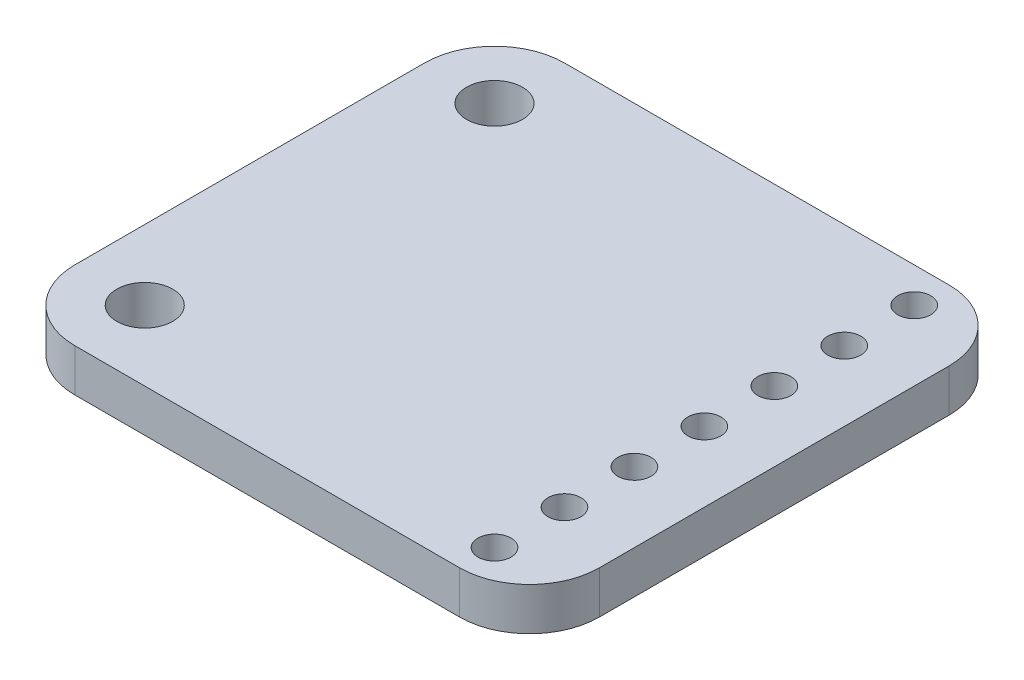
ISO-10303-21;
HEADER;
FILE_DESCRIPTION(('STEP AP214'),'2;1');
FILE_NAME('part.step','',(''),(''),'','','');
FILE_SCHEMA(('AUTOMOTIVE_DESIGN { 1 0 10303 214 1 1 1 1 }'));
ENDSEC;
DATA;
#1=APPLICATION_CONTEXT('core data for automotive mechanical design processes');
#2=APPLICATION_PROTOCOL_DEFINITION('international standard','automotive_design',2000,#1);
#3=PRODUCT_CONTEXT('',#1,'mechanical');
#4=PRODUCT('Part','Part','',(#3));
#5=PRODUCT_RELATED_PRODUCT_CATEGORY('part','',(#4));
#6=PRODUCT_DEFINITION_FORMATION('','',#4);
#7=PRODUCT_DEFINITION_CONTEXT('part definition',#1,'design');
#8=PRODUCT_DEFINITION('design','',#6,#7);
#9=PRODUCT_DEFINITION_SHAPE('','',#8);
#10=(LENGTH_UNIT() NAMED_UNIT(*) SI_UNIT(.MILLI.,.METRE.));
#11=(NAMED_UNIT(*) PLANE_ANGLE_UNIT() SI_UNIT($,.RADIAN.));
#12=(NAMED_UNIT(*) SI_UNIT($,.STERADIAN.) SOLID_ANGLE_UNIT());
#13=UNCERTAINTY_MEASURE_WITH_UNIT(LENGTH_MEASURE(1.E-05),#10,'distance_accuracy_value','');
#14=(GEOMETRIC_REPRESENTATION_CONTEXT(3) GLOBAL_UNCERTAINTY_ASSIGNED_CONTEXT((#13)) GLOBAL_UNIT_ASSIGNED_CONTEXT((#10,
#11,#12)) REPRESENTATION_CONTEXT('',''));
#15=CARTESIAN_POINT('',(0.,0.,0.));
#16=DIRECTION('',(0.,0.,1.));
#17=DIRECTION('',(1.,0.,0.));
#18=AXIS2_PLACEMENT_3D('',#15,#16,#17);
#19=CARTESIAN_POINT('',(0.,1.55,0.));
#20=DIRECTION('',(0.,1.,0.));
#21=DIRECTION('',(0.,0.,1.));
#22=AXIS2_PLACEMENT_3D('',#19,#20,#21);
#23=PLANE('',#22);
#24=CARTESIAN_POINT('',(-6.985,1.55,6.35));
#25=DIRECTION('',(0.,1.,0.));
#26=DIRECTION('',(0.,0.,1.));
#27=AXIS2_PLACEMENT_3D('',#24,#25,#26);
#28=CIRCLE('',#27,1.016);
#29=CARTESIAN_POINT('',(-6.985,1.55,7.366));
#30=VERTEX_POINT('',#29);
#31=EDGE_CURVE('E152',#30,#30,#28,.F.);
#32=ORIENTED_EDGE('',*,*,#31,.T.);
#33=EDGE_LOOP('',(#32));
#34=FACE_BOUND('',#33,.T.);
#35=CARTESIAN_POINT('',(-6.985,1.55,-6.35));
#36=DIRECTION('',(0.,1.,0.));
#37=DIRECTION('',(0.,0.,1.));
#38=AXIS2_PLACEMENT_3D('',#35,#36,#37);
#39=CIRCLE('',#38,1.016);
#40=CARTESIAN_POINT('',(-6.985,1.55,-5.334));
#41=VERTEX_POINT('',#40);
#42=EDGE_CURVE('E155',#41,#41,#39,.F.);
#43=ORIENTED_EDGE('',*,*,#42,.T.);
#44=EDGE_LOOP('',(#43));
#45=FACE_BOUND('',#44,.T.);
#46=CARTESIAN_POINT('',(6.985,1.55,7.62));
#47=DIRECTION('',(0.,1.,0.));
#48=DIRECTION('',(0.,0.,1.));
#49=AXIS2_PLACEMENT_3D('',#46,#47,#48);
#50=CIRCLE('',#49,0.6);
#51=CARTESIAN_POINT('',(6.985,1.55,8.22));
#52=VERTEX_POINT('',#51);
#53=EDGE_CURVE('E158',#52,#52,#50,.F.);
#54=ORIENTED_EDGE('',*,*,#53,.T.);
#55=EDGE_LOOP('',(#54));
#56=FACE_BOUND('',#55,.T.);
#57=CARTESIAN_POINT('',(6.985,1.55,2.54));
#58=DIRECTION('',(0.,1.,0.));
#59=DIRECTION('',(0.,0.,1.));
#60=AXIS2_PLACEMENT_3D('',#57,#58,#59);
#61=CIRCLE('',#60,0.6);
#62=CARTESIAN_POINT('',(6.985,1.55,3.14));
#63=VERTEX_POINT('',#62);
#64=EDGE_CURVE('E161',#63,#63,#61,.F.);
#65=ORIENTED_EDGE('',*,*,#64,.T.);
#66=EDGE_LOOP('',(#65));
#67=FACE_BOUND('',#66,.T.);
#68=CARTESIAN_POINT('',(6.985,1.55,-2.54));
#69=DIRECTION('',(0.,1.,0.));
#70=DIRECTION('',(0.,0.,1.));
#71=AXIS2_PLACEMENT_3D('',#68,#69,#70);
#72=CIRCLE('',#71,0.6);
#73=CARTESIAN_POINT('',(6.985,1.55,-1.94));
#74=VERTEX_POINT('',#73);
#75=EDGE_CURVE('E164',#74,#74,#72,.F.);
#76=ORIENTED_EDGE('',*,*,#75,.T.);
#77=EDGE_LOOP('',(#76));
#78=FACE_BOUND('',#77,.T.);
#79=CARTESIAN_POINT('',(6.985,1.55,-7.62));
#80=DIRECTION('',(0.,1.,0.));
#81=DIRECTION('',(0.,0.,1.));
#82=AXIS2_PLACEMENT_3D('',#79,#80,#81);
#83=CIRCLE('',#82,0.6);
#84=CARTESIAN_POINT('',(6.985,1.55,-7.02));
#85=VERTEX_POINT('',#84);
#86=EDGE_CURVE('E167',#85,#85,#83,.F.);
#87=ORIENTED_EDGE('',*,*,#86,.T.);
#88=EDGE_LOOP('',(#87));
#89=FACE_BOUND('',#88,.T.);
#90=CARTESIAN_POINT('',(6.985,1.55,-5.08));
#91=DIRECTION('',(0.,1.,0.));
#92=DIRECTION('',(0.,0.,1.));
#93=AXIS2_PLACEMENT_3D('',#90,#91,#92);
#94=CIRCLE('',#93,0.6);
#95=CARTESIAN_POINT('',(6.985,1.55,-4.48));
#96=VERTEX_POINT('',#95);
#97=EDGE_CURVE('E170',#96,#96,#94,.F.);
#98=ORIENTED_EDGE('',*,*,#97,.T.);
#99=EDGE_LOOP('',(#98));
#100=FACE_BOUND('',#99,.T.);
#101=CARTESIAN_POINT('',(6.985,1.55,0.));
#102=DIRECTION('',(0.,1.,0.));
#103=DIRECTION('',(0.,0.,1.));
#104=AXIS2_PLACEMENT_3D('',#101,#102,#103);
#105=CIRCLE('',#104,0.6);
#106=CARTESIAN_POINT('',(6.985,1.55,0.599999999999998));
#107=VERTEX_POINT('',#106);
#108=EDGE_CURVE('E173',#107,#107,#105,.F.);
#109=ORIENTED_EDGE('',*,*,#108,.T.);
#110=EDGE_LOOP('',(#109));
#111=FACE_BOUND('',#110,.T.);
#112=CARTESIAN_POINT('',(6.985,1.55,5.08));
#113=DIRECTION('',(0.,1.,0.));
#114=DIRECTION('',(0.,0.,1.));
#115=AXIS2_PLACEMENT_3D('',#112,#113,#114);
#116=CIRCLE('',#115,0.6);
#117=CARTESIAN_POINT('',(6.985,1.55,5.68));
#118=VERTEX_POINT('',#117);
#119=EDGE_CURVE('E176',#118,#118,#116,.F.);
#120=ORIENTED_EDGE('',*,*,#119,.T.);
#121=EDGE_LOOP('',(#120));
#122=FACE_BOUND('',#121,.T.);
#123=CARTESIAN_POINT('',(-6.985,1.55,6.35));
#124=DIRECTION('',(0.,1.,0.));
#125=DIRECTION('',(0.,0.,1.));
#126=AXIS2_PLACEMENT_3D('',#123,#124,#125);
#127=CIRCLE('',#126,2.54);
#128=CARTESIAN_POINT('',(-6.985,1.55,8.89));
#129=VERTEX_POINT('',#128);
#130=CARTESIAN_POINT('',(-9.525,1.55,6.35));
#131=VERTEX_POINT('',#130);
#132=EDGE_CURVE('E181',#129,#131,#127,.F.);
#133=ORIENTED_EDGE('',*,*,#132,.F.);
#134=DIRECTION('',(1.,0.,0.));
#135=VECTOR('',#134,1.);
#136=CARTESIAN_POINT('',(-9.525,1.55,8.89));
#137=LINE('',#136,#135);
#138=CARTESIAN_POINT('',(6.985,1.55,8.89));
#139=VERTEX_POINT('',#138);
#140=EDGE_CURVE('E106',#139,#129,#137,.F.);
#141=ORIENTED_EDGE('',*,*,#140,.F.);
#142=CARTESIAN_POINT('',(6.985,1.55,6.35));
#143=DIRECTION('',(0.,1.,0.));
#144=DIRECTION('',(0.,0.,1.));
#145=AXIS2_PLACEMENT_3D('',#142,#143,#144);
#146=CIRCLE('',#145,2.54);
#147=CARTESIAN_POINT('',(9.525,1.55,6.35));
#148=VERTEX_POINT('',#147);
#149=EDGE_CURVE('E93',#148,#139,#146,.F.);
#150=ORIENTED_EDGE('',*,*,#149,.F.);
#151=DIRECTION('',(0.,0.,-1.));
#152=VECTOR('',#151,1.);
#153=CARTESIAN_POINT('',(9.525,1.55,8.89));
#154=LINE('',#153,#152);
#155=CARTESIAN_POINT('',(9.525,1.55,-6.35));
#156=VERTEX_POINT('',#155);
#157=EDGE_CURVE('E89',#156,#148,#154,.F.);
#158=ORIENTED_EDGE('',*,*,#157,.F.);
#159=CARTESIAN_POINT('',(6.985,1.55,-6.35));
#160=DIRECTION('',(0.,1.,0.));
#161=DIRECTION('',(0.,0.,1.));
#162=AXIS2_PLACEMENT_3D('',#159,#160,#161);
#163=CIRCLE('',#162,2.54);
#164=CARTESIAN_POINT('',(6.985,1.55,-8.89));
#165=VERTEX_POINT('',#164);
#166=EDGE_CURVE('E20',#165,#156,#163,.F.);
#167=ORIENTED_EDGE('',*,*,#166,.F.);
#168=DIRECTION('',(-1.,0.,0.));
#169=VECTOR('',#168,1.);
#170=CARTESIAN_POINT('',(9.525,1.55,-8.89));
#171=LINE('',#170,#169);
#172=CARTESIAN_POINT('',(-6.985,1.55,-8.89));
#173=VERTEX_POINT('',#172);
#174=EDGE_CURVE('E102',#173,#165,#171,.F.);
#175=ORIENTED_EDGE('',*,*,#174,.F.);
#176=CARTESIAN_POINT('',(-6.985,1.55,-6.35));
#177=DIRECTION('',(0.,1.,0.));
#178=DIRECTION('',(0.,0.,1.));
#179=AXIS2_PLACEMENT_3D('',#176,#177,#178);
#180=CIRCLE('',#179,2.54);
#181=CARTESIAN_POINT('',(-9.525,1.55,-6.35));
#182=VERTEX_POINT('',#181);
#183=EDGE_CURVE('E114',#182,#173,#180,.F.);
#184=ORIENTED_EDGE('',*,*,#183,.F.);
#185=DIRECTION('',(0.,0.,1.));
#186=VECTOR('',#185,1.);
#187=CARTESIAN_POINT('',(-9.525,1.55,-8.89));
#188=LINE('',#187,#186);
#189=EDGE_CURVE('E110',#131,#182,#188,.F.);
#190=ORIENTED_EDGE('',*,*,#189,.F.);
#191=EDGE_LOOP('',(#133,#141,#150,#158,#167,#175,#184,#190));
#192=FACE_BOUND('',#191,.T.);
#193=ADVANCED_FACE('F17',(#34,#45,#56,#67,#78,#89,#100,#111,#122,#192),#23,.T.);
#194=CARTESIAN_POINT('',(9.525,0.,8.89));
#195=DIRECTION('',(1.,0.,0.));
#196=DIRECTION('',(0.,0.,-1.));
#197=AXIS2_PLACEMENT_3D('',#194,#195,#196);
#198=PLANE('',#197);
#199=DIRECTION('',(0.,1.,0.));
#200=VECTOR('',#199,1.);
#201=CARTESIAN_POINT('',(9.525,0.,-6.35));
#202=LINE('',#201,#200);
#203=CARTESIAN_POINT('',(9.525,0.,-6.35));
#204=VERTEX_POINT('',#203);
#205=EDGE_CURVE('E86',#156,#204,#202,.F.);
#206=ORIENTED_EDGE('',*,*,#205,.F.);
#207=ORIENTED_EDGE('',*,*,#157,.T.);
#208=DIRECTION('',(0.,1.,0.));
#209=VECTOR('',#208,1.);
#210=CARTESIAN_POINT('',(9.525,0.,6.35));
#211=LINE('',#210,#209);
#212=CARTESIAN_POINT('',(9.525,0.,6.35));
#213=VERTEX_POINT('',#212);
#214=EDGE_CURVE('E179',#213,#148,#211,.T.);
#215=ORIENTED_EDGE('',*,*,#214,.F.);
#216=DIRECTION('',(0.,0.,1.));
#217=VECTOR('',#216,1.);
#218=CARTESIAN_POINT('',(9.525,0.,0.));
#219=LINE('',#218,#217);
#220=EDGE_CURVE('E100',#213,#204,#219,.F.);
#221=ORIENTED_EDGE('',*,*,#220,.T.);
#222=EDGE_LOOP('',(#206,#207,#215,#221));
#223=FACE_BOUND('',#222,.T.);
#224=ADVANCED_FACE('F99',(#223),#198,.T.);
#225=CARTESIAN_POINT('',(6.985,0.,-6.35));
#226=DIRECTION('',(0.,1.,0.));
#227=DIRECTION('',(0.,0.,1.));
#228=AXIS2_PLACEMENT_3D('',#225,#226,#227);
#229=CYLINDRICAL_SURFACE('',#228,2.54);
#230=CARTESIAN_POINT('',(6.985,0.,-6.35));
#231=DIRECTION('',(0.,1.,0.));
#232=DIRECTION('',(0.,0.,1.));
#233=AXIS2_PLACEMENT_3D('',#230,#231,#232);
#234=CIRCLE('',#233,2.54);
#235=CARTESIAN_POINT('',(6.985,0.,-8.89));
#236=VERTEX_POINT('',#235);
#237=EDGE_CURVE('E150',#204,#236,#234,.T.);
#238=ORIENTED_EDGE('',*,*,#237,.T.);
#239=DIRECTION('',(0.,1.,0.));
#240=VECTOR('',#239,1.);
#241=CARTESIAN_POINT('',(6.985,0.,-8.89));
#242=LINE('',#241,#240);
#243=EDGE_CURVE('E88',#165,#236,#242,.F.);
#244=ORIENTED_EDGE('',*,*,#243,.F.);
#245=ORIENTED_EDGE('',*,*,#166,.T.);
#246=ORIENTED_EDGE('',*,*,#205,.T.);
#247=EDGE_LOOP('',(#238,#244,#245,#246));
#248=FACE_BOUND('',#247,.T.);
#249=ADVANCED_FACE('F84',(#248),#229,.T.);
#250=CARTESIAN_POINT('',(9.525,0.,-8.89));
#251=DIRECTION('',(0.,0.,-1.));
#252=DIRECTION('',(-1.,0.,0.));
#253=AXIS2_PLACEMENT_3D('',#250,#251,#252);
#254=PLANE('',#253);
#255=DIRECTION('',(0.,1.,0.));
#256=VECTOR('',#255,1.);
#257=CARTESIAN_POINT('',(-6.985,0.,-8.89));
#258=LINE('',#257,#256);
#259=CARTESIAN_POINT('',(-6.985,0.,-8.89));
#260=VERTEX_POINT('',#259);
#261=EDGE_CURVE('E113',#173,#260,#258,.F.);
#262=ORIENTED_EDGE('',*,*,#261,.F.);
#263=ORIENTED_EDGE('',*,*,#174,.T.);
#264=ORIENTED_EDGE('',*,*,#243,.T.);
#265=DIRECTION('',(1.,0.,0.));
#266=VECTOR('',#265,1.);
#267=CARTESIAN_POINT('',(0.,0.,-8.89));
#268=LINE('',#267,#266);
#269=EDGE_CURVE('E149',#236,#260,#268,.F.);
#270=ORIENTED_EDGE('',*,*,#269,.T.);
#271=EDGE_LOOP('',(#262,#263,#264,#270));
#272=FACE_BOUND('',#271,.T.);
#273=ADVANCED_FACE('F216',(#272),#254,.T.);
#274=CARTESIAN_POINT('',(-6.985,0.,-6.35));
#275=DIRECTION('',(0.,1.,0.));
#276=DIRECTION('',(0.,0.,1.));
#277=AXIS2_PLACEMENT_3D('',#274,#275,#276);
#278=CYLINDRICAL_SURFACE('',#277,2.54);
#279=CARTESIAN_POINT('',(-6.985,0.,-6.35));
#280=DIRECTION('',(0.,1.,0.));
#281=DIRECTION('',(0.,0.,1.));
#282=AXIS2_PLACEMENT_3D('',#279,#280,#281);
#283=CIRCLE('',#282,2.54);
#284=CARTESIAN_POINT('',(-9.525,0.,-6.35));
#285=VERTEX_POINT('',#284);
#286=EDGE_CURVE('E146',#260,#285,#283,.T.);
#287=ORIENTED_EDGE('',*,*,#286,.T.);
#288=DIRECTION('',(0.,1.,0.));
#289=VECTOR('',#288,1.);
#290=CARTESIAN_POINT('',(-9.525,0.,-6.35));
#291=LINE('',#290,#289);
#292=EDGE_CURVE('E112',#182,#285,#291,.F.);
#293=ORIENTED_EDGE('',*,*,#292,.F.);
#294=ORIENTED_EDGE('',*,*,#183,.T.);
#295=ORIENTED_EDGE('',*,*,#261,.T.);
#296=EDGE_LOOP('',(#287,#293,#294,#295));
#297=FACE_BOUND('',#296,.T.);
#298=ADVANCED_FACE('F214',(#297),#278,.T.);
#299=CARTESIAN_POINT('',(-9.525,0.,-8.89));
#300=DIRECTION('',(-1.,0.,0.));
#301=DIRECTION('',(0.,0.,1.));
#302=AXIS2_PLACEMENT_3D('',#299,#300,#301);
#303=PLANE('',#302);
#304=ORIENTED_EDGE('',*,*,#292,.T.);
#305=DIRECTION('',(0.,0.,1.));
#306=VECTOR('',#305,1.);
#307=CARTESIAN_POINT('',(-9.525,0.,0.));
#308=LINE('',#307,#306);
#309=CARTESIAN_POINT('',(-9.525,0.,6.35));
#310=VERTEX_POINT('',#309);
#311=EDGE_CURVE('E145',#285,#310,#308,.T.);
#312=ORIENTED_EDGE('',*,*,#311,.T.);
#313=DIRECTION('',(0.,1.,0.));
#314=VECTOR('',#313,1.);
#315=CARTESIAN_POINT('',(-9.525,0.,6.35));
#316=LINE('',#315,#314);
#317=EDGE_CURVE('E109',#131,#310,#316,.F.);
#318=ORIENTED_EDGE('',*,*,#317,.F.);
#319=ORIENTED_EDGE('',*,*,#189,.T.);
#320=EDGE_LOOP('',(#304,#312,#318,#319));
#321=FACE_BOUND('',#320,.T.);
#322=ADVANCED_FACE('F212',(#321),#303,.T.);
#323=CARTESIAN_POINT('',(-6.985,0.,6.35));
#324=DIRECTION('',(0.,1.,0.));
#325=DIRECTION('',(0.,0.,1.));
#326=AXIS2_PLACEMENT_3D('',#323,#324,#325);
#327=CYLINDRICAL_SURFACE('',#326,2.54);
#328=CARTESIAN_POINT('',(-6.985,0.,6.35));
#329=DIRECTION('',(0.,1.,0.));
#330=DIRECTION('',(0.,0.,1.));
#331=AXIS2_PLACEMENT_3D('',#328,#329,#330);
#332=CIRCLE('',#331,2.54);
#333=CARTESIAN_POINT('',(-6.985,0.,8.89));
#334=VERTEX_POINT('',#333);
#335=EDGE_CURVE('E142',#310,#334,#332,.T.);
#336=ORIENTED_EDGE('',*,*,#335,.T.);
#337=DIRECTION('',(0.,1.,0.));
#338=VECTOR('',#337,1.);
#339=CARTESIAN_POINT('',(-6.985,0.,8.89));
#340=LINE('',#339,#338);
#341=EDGE_CURVE('E108',#129,#334,#340,.F.);
#342=ORIENTED_EDGE('',*,*,#341,.F.);
#343=ORIENTED_EDGE('',*,*,#132,.T.);
#344=ORIENTED_EDGE('',*,*,#317,.T.);
#345=EDGE_LOOP('',(#336,#342,#343,#344));
#346=FACE_BOUND('',#345,.T.);
#347=ADVANCED_FACE('F208',(#346),#327,.T.);
#348=CARTESIAN_POINT('',(-9.525,0.,8.89));
#349=DIRECTION('',(0.,0.,1.));
#350=DIRECTION('',(1.,0.,0.));
#351=AXIS2_PLACEMENT_3D('',#348,#349,#350);
#352=PLANE('',#351);
#353=ORIENTED_EDGE('',*,*,#341,.T.);
#354=DIRECTION('',(1.,0.,0.));
#355=VECTOR('',#354,1.);
#356=CARTESIAN_POINT('',(0.,0.,8.89));
#357=LINE('',#356,#355);
#358=CARTESIAN_POINT('',(6.985,0.,8.89));
#359=VERTEX_POINT('',#358);
#360=EDGE_CURVE('E141',#334,#359,#357,.T.);
#361=ORIENTED_EDGE('',*,*,#360,.T.);
#362=DIRECTION('',(0.,1.,0.));
#363=VECTOR('',#362,1.);
#364=CARTESIAN_POINT('',(6.985,0.,8.89));
#365=LINE('',#364,#363);
#366=EDGE_CURVE('E35',#139,#359,#365,.F.);
#367=ORIENTED_EDGE('',*,*,#366,.F.);
#368=ORIENTED_EDGE('',*,*,#140,.T.);
#369=EDGE_LOOP('',(#353,#361,#367,#368));
#370=FACE_BOUND('',#369,.T.);
#371=ADVANCED_FACE('F201',(#370),#352,.T.);
#372=CARTESIAN_POINT('',(6.985,0.,6.35));
#373=DIRECTION('',(0.,1.,0.));
#374=DIRECTION('',(0.,0.,1.));
#375=AXIS2_PLACEMENT_3D('',#372,#373,#374);
#376=CYLINDRICAL_SURFACE('',#375,2.54);
#377=CARTESIAN_POINT('',(6.985,0.,6.35));
#378=DIRECTION('',(0.,1.,0.));
#379=DIRECTION('',(0.,0.,1.));
#380=AXIS2_PLACEMENT_3D('',#377,#378,#379);
#381=CIRCLE('',#380,2.54);
#382=EDGE_CURVE('E139',#359,#213,#381,.T.);
#383=ORIENTED_EDGE('',*,*,#382,.T.);
#384=ORIENTED_EDGE('',*,*,#214,.T.);
#385=ORIENTED_EDGE('',*,*,#149,.T.);
#386=ORIENTED_EDGE('',*,*,#366,.T.);
#387=EDGE_LOOP('',(#383,#384,#385,#386));
#388=FACE_BOUND('',#387,.T.);
#389=ADVANCED_FACE('F269',(#388),#376,.T.);
#390=CARTESIAN_POINT('',(6.985,-24.5542793426672,5.08));
#391=DIRECTION('',(0.,1.,0.));
#392=DIRECTION('',(0.,0.,1.));
#393=AXIS2_PLACEMENT_3D('',#390,#391,#392);
#394=CYLINDRICAL_SURFACE('',#393,0.6);
#395=CARTESIAN_POINT('',(6.985,0.,5.08));
#396=DIRECTION('',(0.,1.,0.));
#397=DIRECTION('',(0.,0.,1.));
#398=AXIS2_PLACEMENT_3D('',#395,#396,#397);
#399=CIRCLE('',#398,0.6);
#400=CARTESIAN_POINT('',(6.985,0.,5.68));
#401=VERTEX_POINT('',#400);
#402=EDGE_CURVE('E136',#401,#401,#399,.F.);
#403=ORIENTED_EDGE('',*,*,#402,.T.);
#404=EDGE_LOOP('',(#403));
#405=FACE_BOUND('',#404,.T.);
#406=ORIENTED_EDGE('',*,*,#119,.F.);
#407=EDGE_LOOP('',(#406));
#408=FACE_BOUND('',#407,.T.);
#409=ADVANCED_FACE('F265',(#405,#408),#394,.F.);
#410=CARTESIAN_POINT('',(6.985,-24.5542793426672,0.));
#411=DIRECTION('',(0.,1.,0.));
#412=DIRECTION('',(0.,0.,1.));
#413=AXIS2_PLACEMENT_3D('',#410,#411,#412);
#414=CYLINDRICAL_SURFACE('',#413,0.6);
#415=CARTESIAN_POINT('',(6.985,0.,0.));
#416=DIRECTION('',(0.,1.,0.));
#417=DIRECTION('',(0.,0.,1.));
#418=AXIS2_PLACEMENT_3D('',#415,#416,#417);
#419=CIRCLE('',#418,0.6);
#420=CARTESIAN_POINT('',(6.985,0.,0.599999999999998));
#421=VERTEX_POINT('',#420);
#422=EDGE_CURVE('E133',#421,#421,#419,.F.);
#423=ORIENTED_EDGE('',*,*,#422,.T.);
#424=EDGE_LOOP('',(#423));
#425=FACE_BOUND('',#424,.T.);
#426=ORIENTED_EDGE('',*,*,#108,.F.);
#427=EDGE_LOOP('',(#426));
#428=FACE_BOUND('',#427,.T.);
#429=ADVANCED_FACE('F261',(#425,#428),#414,.F.);
#430=CARTESIAN_POINT('',(6.985,-24.5542793426672,-5.08));
#431=DIRECTION('',(0.,1.,0.));
#432=DIRECTION('',(0.,0.,1.));
#433=AXIS2_PLACEMENT_3D('',#430,#431,#432);
#434=CYLINDRICAL_SURFACE('',#433,0.6);
#435=CARTESIAN_POINT('',(6.985,0.,-5.08));
#436=DIRECTION('',(0.,1.,0.));
#437=DIRECTION('',(0.,0.,1.));
#438=AXIS2_PLACEMENT_3D('',#435,#436,#437);
#439=CIRCLE('',#438,0.6);
#440=CARTESIAN_POINT('',(6.985,0.,-4.48));
#441=VERTEX_POINT('',#440);
#442=EDGE_CURVE('E130',#441,#441,#439,.F.);
#443=ORIENTED_EDGE('',*,*,#442,.T.);
#444=EDGE_LOOP('',(#443));
#445=FACE_BOUND('',#444,.T.);
#446=ORIENTED_EDGE('',*,*,#97,.F.);
#447=EDGE_LOOP('',(#446));
#448=FACE_BOUND('',#447,.T.);
#449=ADVANCED_FACE('F257',(#445,#448),#434,.F.);
#450=CARTESIAN_POINT('',(6.985,-24.5542793426672,-7.62));
#451=DIRECTION('',(0.,1.,0.));
#452=DIRECTION('',(0.,0.,1.));
#453=AXIS2_PLACEMENT_3D('',#450,#451,#452);
#454=CYLINDRICAL_SURFACE('',#453,0.6);
#455=CARTESIAN_POINT('',(6.985,0.,-7.62));
#456=DIRECTION('',(0.,1.,0.));
#457=DIRECTION('',(0.,0.,1.));
#458=AXIS2_PLACEMENT_3D('',#455,#456,#457);
#459=CIRCLE('',#458,0.6);
#460=CARTESIAN_POINT('',(6.985,0.,-7.02));
#461=VERTEX_POINT('',#460);
#462=EDGE_CURVE('E127',#461,#461,#459,.F.);
#463=ORIENTED_EDGE('',*,*,#462,.T.);
#464=EDGE_LOOP('',(#463));
#465=FACE_BOUND('',#464,.T.);
#466=ORIENTED_EDGE('',*,*,#86,.F.);
#467=EDGE_LOOP('',(#466));
#468=FACE_BOUND('',#467,.T.);
#469=ADVANCED_FACE('F253',(#465,#468),#454,.F.);
#470=CARTESIAN_POINT('',(6.985,-24.5542793426672,-2.54));
#471=DIRECTION('',(0.,1.,0.));
#472=DIRECTION('',(0.,0.,1.));
#473=AXIS2_PLACEMENT_3D('',#470,#471,#472);
#474=CYLINDRICAL_SURFACE('',#473,0.6);
#475=CARTESIAN_POINT('',(6.985,0.,-2.54));
#476=DIRECTION('',(0.,1.,0.));
#477=DIRECTION('',(0.,0.,1.));
#478=AXIS2_PLACEMENT_3D('',#475,#476,#477);
#479=CIRCLE('',#478,0.6);
#480=CARTESIAN_POINT('',(6.985,0.,-1.94));
#481=VERTEX_POINT('',#480);
#482=EDGE_CURVE('E124',#481,#481,#479,.F.);
#483=ORIENTED_EDGE('',*,*,#482,.T.);
#484=EDGE_LOOP('',(#483));
#485=FACE_BOUND('',#484,.T.);
#486=ORIENTED_EDGE('',*,*,#75,.F.);
#487=EDGE_LOOP('',(#486));
#488=FACE_BOUND('',#487,.T.);
#489=ADVANCED_FACE('F249',(#485,#488),#474,.F.);
#490=CARTESIAN_POINT('',(6.985,-24.5542793426672,2.54));
#491=DIRECTION('',(0.,1.,0.));
#492=DIRECTION('',(0.,0.,1.));
#493=AXIS2_PLACEMENT_3D('',#490,#491,#492);
#494=CYLINDRICAL_SURFACE('',#493,0.6);
#495=CARTESIAN_POINT('',(6.985,0.,2.54));
#496=DIRECTION('',(0.,1.,0.));
#497=DIRECTION('',(0.,0.,1.));
#498=AXIS2_PLACEMENT_3D('',#495,#496,#497);
#499=CIRCLE('',#498,0.6);
#500=CARTESIAN_POINT('',(6.985,0.,3.14));
#501=VERTEX_POINT('',#500);
#502=EDGE_CURVE('E121',#501,#501,#499,.F.);
#503=ORIENTED_EDGE('',*,*,#502,.T.);
#504=EDGE_LOOP('',(#503));
#505=FACE_BOUND('',#504,.T.);
#506=ORIENTED_EDGE('',*,*,#64,.F.);
#507=EDGE_LOOP('',(#506));
#508=FACE_BOUND('',#507,.T.);
#509=ADVANCED_FACE('F245',(#505,#508),#494,.F.);
#510=CARTESIAN_POINT('',(6.985,-24.5542793426672,7.62));
#511=DIRECTION('',(0.,1.,0.));
#512=DIRECTION('',(0.,0.,1.));
#513=AXIS2_PLACEMENT_3D('',#510,#511,#512);
#514=CYLINDRICAL_SURFACE('',#513,0.6);
#515=CARTESIAN_POINT('',(6.985,0.,7.62));
#516=DIRECTION('',(0.,1.,0.));
#517=DIRECTION('',(0.,0.,1.));
#518=AXIS2_PLACEMENT_3D('',#515,#516,#517);
#519=CIRCLE('',#518,0.6);
#520=CARTESIAN_POINT('',(6.985,0.,8.22));
#521=VERTEX_POINT('',#520);
#522=EDGE_CURVE('E118',#521,#521,#519,.F.);
#523=ORIENTED_EDGE('',*,*,#522,.T.);
#524=EDGE_LOOP('',(#523));
#525=FACE_BOUND('',#524,.T.);
#526=ORIENTED_EDGE('',*,*,#53,.F.);
#527=EDGE_LOOP('',(#526));
#528=FACE_BOUND('',#527,.T.);
#529=ADVANCED_FACE('F241',(#525,#528),#514,.F.);
#530=CARTESIAN_POINT('',(-6.985,-24.5542793426672,-6.35));
#531=DIRECTION('',(0.,1.,0.));
#532=DIRECTION('',(0.,0.,1.));
#533=AXIS2_PLACEMENT_3D('',#530,#531,#532);
#534=CYLINDRICAL_SURFACE('',#533,1.016);
#535=CARTESIAN_POINT('',(-6.985,0.,-6.35));
#536=DIRECTION('',(0.,1.,0.));
#537=DIRECTION('',(0.,0.,1.));
#538=AXIS2_PLACEMENT_3D('',#535,#536,#537);
#539=CIRCLE('',#538,1.016);
#540=CARTESIAN_POINT('',(-6.985,0.,-5.334));
#541=VERTEX_POINT('',#540);
#542=EDGE_CURVE('E26',#541,#541,#539,.F.);
#543=ORIENTED_EDGE('',*,*,#542,.T.);
#544=EDGE_LOOP('',(#543));
#545=FACE_BOUND('',#544,.T.);
#546=ORIENTED_EDGE('',*,*,#42,.F.);
#547=EDGE_LOOP('',(#546));
#548=FACE_BOUND('',#547,.T.);
#549=ADVANCED_FACE('F233',(#545,#548),#534,.F.);
#550=CARTESIAN_POINT('',(-6.985,-24.5542793426672,6.35));
#551=DIRECTION('',(0.,1.,0.));
#552=DIRECTION('',(0.,0.,1.));
#553=AXIS2_PLACEMENT_3D('',#550,#551,#552);
#554=CYLINDRICAL_SURFACE('',#553,1.016);
#555=CARTESIAN_POINT('',(-6.985,0.,6.35));
#556=DIRECTION('',(0.,1.,0.));
#557=DIRECTION('',(0.,0.,1.));
#558=AXIS2_PLACEMENT_3D('',#555,#556,#557);
#559=CIRCLE('',#558,1.016);
#560=CARTESIAN_POINT('',(-6.985,0.,7.366));
#561=VERTEX_POINT('',#560);
#562=EDGE_CURVE('E11',#561,#561,#559,.F.);
#563=ORIENTED_EDGE('',*,*,#562,.T.);
#564=EDGE_LOOP('',(#563));
#565=FACE_BOUND('',#564,.T.);
#566=ORIENTED_EDGE('',*,*,#31,.F.);
#567=EDGE_LOOP('',(#566));
#568=FACE_BOUND('',#567,.T.);
#569=ADVANCED_FACE('F227',(#565,#568),#554,.F.);
#570=CARTESIAN_POINT('',(0.,0.,0.));
#571=DIRECTION('',(0.,1.,0.));
#572=DIRECTION('',(0.,0.,1.));
#573=AXIS2_PLACEMENT_3D('',#570,#571,#572);
#574=PLANE('',#573);
#575=ORIENTED_EDGE('',*,*,#562,.F.);
#576=EDGE_LOOP('',(#575));
#577=FACE_BOUND('',#576,.T.);
#578=ORIENTED_EDGE('',*,*,#542,.F.);
#579=EDGE_LOOP('',(#578));
#580=FACE_BOUND('',#579,.T.);
#581=ORIENTED_EDGE('',*,*,#522,.F.);
#582=EDGE_LOOP('',(#581));
#583=FACE_BOUND('',#582,.T.);
#584=ORIENTED_EDGE('',*,*,#502,.F.);
#585=EDGE_LOOP('',(#584));
#586=FACE_BOUND('',#585,.T.);
#587=ORIENTED_EDGE('',*,*,#482,.F.);
#588=EDGE_LOOP('',(#587));
#589=FACE_BOUND('',#588,.T.);
#590=ORIENTED_EDGE('',*,*,#462,.F.);
#591=EDGE_LOOP('',(#590));
#592=FACE_BOUND('',#591,.T.);
#593=ORIENTED_EDGE('',*,*,#442,.F.);
#594=EDGE_LOOP('',(#593));
#595=FACE_BOUND('',#594,.T.);
#596=ORIENTED_EDGE('',*,*,#422,.F.);
#597=EDGE_LOOP('',(#596));
#598=FACE_BOUND('',#597,.T.);
#599=ORIENTED_EDGE('',*,*,#402,.F.);
#600=EDGE_LOOP('',(#599));
#601=FACE_BOUND('',#600,.T.);
#602=ORIENTED_EDGE('',*,*,#360,.F.);
#603=ORIENTED_EDGE('',*,*,#335,.F.);
#604=ORIENTED_EDGE('',*,*,#311,.F.);
#605=ORIENTED_EDGE('',*,*,#286,.F.);
#606=ORIENTED_EDGE('',*,*,#269,.F.);
#607=ORIENTED_EDGE('',*,*,#237,.F.);
#608=ORIENTED_EDGE('',*,*,#220,.F.);
#609=ORIENTED_EDGE('',*,*,#382,.F.);
#610=EDGE_LOOP('',(#602,#603,#604,#605,#606,#607,#608,#609));
#611=FACE_BOUND('',#610,.T.);
#612=ADVANCED_FACE('F205',(#577,#580,#583,#586,#589,#592,#595,#598,#601,#611),#574,.F.);
#613=CLOSED_SHELL('',(#193,#224,#249,#273,#298,#322,#347,#371,#389,#409,#429,#449,#469,#489,
#509,#529,#549,#569,#612));
#614=MANIFOLD_SOLID_BREP('B1',#613);
#615=ADVANCED_BREP_SHAPE_REPRESENTATION('',(#18,#614),#14);
#616=SHAPE_DEFINITION_REPRESENTATION(#9,#615);
ENDSEC;
END-ISO-10303-21;
